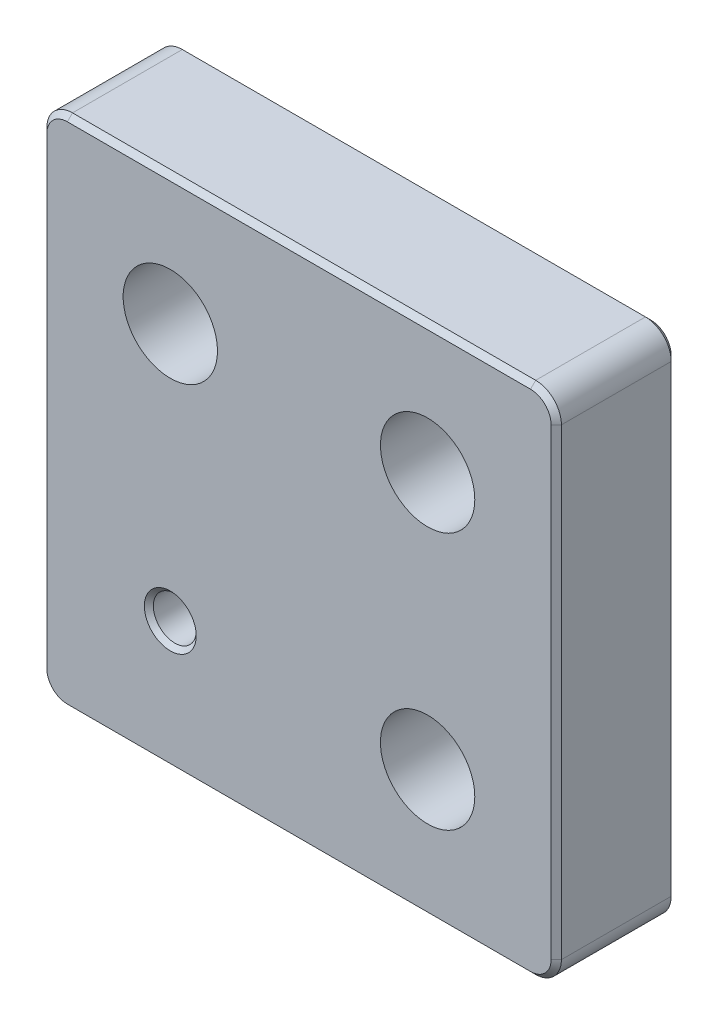
ISO-10303-21;
HEADER;
FILE_DESCRIPTION(('STEP AP214'),'2;1');
FILE_NAME('part.step','',(''),(''),'','','');
FILE_SCHEMA(('AUTOMOTIVE_DESIGN { 1 0 10303 214 1 1 1 1 }'));
ENDSEC;
DATA;
#1=APPLICATION_CONTEXT('core data for automotive mechanical design processes');
#2=APPLICATION_PROTOCOL_DEFINITION('international standard','automotive_design',2000,#1);
#3=PRODUCT_CONTEXT('',#1,'mechanical');
#4=PRODUCT('Part','Part','',(#3));
#5=PRODUCT_RELATED_PRODUCT_CATEGORY('part','',(#4));
#6=PRODUCT_DEFINITION_FORMATION('','',#4);
#7=PRODUCT_DEFINITION_CONTEXT('part definition',#1,'design');
#8=PRODUCT_DEFINITION('design','',#6,#7);
#9=PRODUCT_DEFINITION_SHAPE('','',#8);
#10=(LENGTH_UNIT() NAMED_UNIT(*) SI_UNIT(.MILLI.,.METRE.));
#11=(NAMED_UNIT(*) PLANE_ANGLE_UNIT() SI_UNIT($,.RADIAN.));
#12=(NAMED_UNIT(*) SI_UNIT($,.STERADIAN.) SOLID_ANGLE_UNIT());
#13=UNCERTAINTY_MEASURE_WITH_UNIT(LENGTH_MEASURE(1.E-05),#10,'distance_accuracy_value','');
#14=(GEOMETRIC_REPRESENTATION_CONTEXT(3) GLOBAL_UNCERTAINTY_ASSIGNED_CONTEXT((#13)) GLOBAL_UNIT_ASSIGNED_CONTEXT((#10,
#11,#12)) REPRESENTATION_CONTEXT('',''));
#15=CARTESIAN_POINT('',(0.,0.,0.));
#16=DIRECTION('',(0.,0.,1.));
#17=DIRECTION('',(1.,0.,0.));
#18=AXIS2_PLACEMENT_3D('',#15,#16,#17);
#19=CARTESIAN_POINT('',(-30.,-30.,14.));
#20=DIRECTION('',(1.,0.,0.));
#21=DIRECTION('',(0.,0.,-1.));
#22=AXIS2_PLACEMENT_3D('',#19,#20,#21);
#23=PLANE('',#22);
#24=DIRECTION('',(0.,0.,-1.));
#25=VECTOR('',#24,1.);
#26=CARTESIAN_POINT('',(-30.,27.,14.));
#27=LINE('',#26,#25);
#28=CARTESIAN_POINT('',(-30.,27.,13.4));
#29=VERTEX_POINT('',#28);
#30=CARTESIAN_POINT('',(-30.,27.,0.599999999999996));
#31=VERTEX_POINT('',#30);
#32=EDGE_CURVE('E343',#29,#31,#27,.T.);
#33=ORIENTED_EDGE('',*,*,#32,.T.);
#34=DIRECTION('',(0.,-1.,0.));
#35=VECTOR('',#34,1.);
#36=CARTESIAN_POINT('',(-30.,-30.,0.599999999999996));
#37=LINE('',#36,#35);
#38=CARTESIAN_POINT('',(-30.,-27.,0.599999999999996));
#39=VERTEX_POINT('',#38);
#40=EDGE_CURVE('E243',#31,#39,#37,.T.);
#41=ORIENTED_EDGE('',*,*,#40,.T.);
#42=DIRECTION('',(0.,0.,-1.));
#43=VECTOR('',#42,1.);
#44=CARTESIAN_POINT('',(-30.,-27.,14.));
#45=LINE('',#44,#43);
#46=CARTESIAN_POINT('',(-30.,-27.,13.4));
#47=VERTEX_POINT('',#46);
#48=EDGE_CURVE('E336',#39,#47,#45,.F.);
#49=ORIENTED_EDGE('',*,*,#48,.T.);
#50=DIRECTION('',(0.,1.,0.));
#51=VECTOR('',#50,1.);
#52=CARTESIAN_POINT('',(-30.,27.,13.4));
#53=LINE('',#52,#51);
#54=EDGE_CURVE('E240',#47,#29,#53,.T.);
#55=ORIENTED_EDGE('',*,*,#54,.T.);
#56=EDGE_LOOP('',(#33,#41,#49,#55));
#57=FACE_BOUND('',#56,.T.);
#58=ADVANCED_FACE('F46',(#57),#23,.F.);
#59=CARTESIAN_POINT('',(30.,-30.,14.));
#60=DIRECTION('',(0.,1.,0.));
#61=DIRECTION('',(-1.,0.,0.));
#62=AXIS2_PLACEMENT_3D('',#59,#60,#61);
#63=PLANE('',#62);
#64=DIRECTION('',(0.,0.,-1.));
#65=VECTOR('',#64,1.);
#66=CARTESIAN_POINT('',(-27.,-30.,14.));
#67=LINE('',#66,#65);
#68=CARTESIAN_POINT('',(-27.,-30.,13.4));
#69=VERTEX_POINT('',#68);
#70=CARTESIAN_POINT('',(-27.,-30.,0.599999999999996));
#71=VERTEX_POINT('',#70);
#72=EDGE_CURVE('E338',#69,#71,#67,.T.);
#73=ORIENTED_EDGE('',*,*,#72,.T.);
#74=DIRECTION('',(1.,0.,0.));
#75=VECTOR('',#74,1.);
#76=CARTESIAN_POINT('',(30.,-30.,0.599999999999996));
#77=LINE('',#76,#75);
#78=CARTESIAN_POINT('',(27.,-30.,0.599999999999996));
#79=VERTEX_POINT('',#78);
#80=EDGE_CURVE('E206',#71,#79,#77,.T.);
#81=ORIENTED_EDGE('',*,*,#80,.T.);
#82=DIRECTION('',(0.,0.,-1.));
#83=VECTOR('',#82,1.);
#84=CARTESIAN_POINT('',(27.,-30.,14.));
#85=LINE('',#84,#83);
#86=CARTESIAN_POINT('',(27.,-30.,13.4));
#87=VERTEX_POINT('',#86);
#88=EDGE_CURVE('E183',#79,#87,#85,.F.);
#89=ORIENTED_EDGE('',*,*,#88,.T.);
#90=DIRECTION('',(-1.,0.,0.));
#91=VECTOR('',#90,1.);
#92=CARTESIAN_POINT('',(-27.,-30.,13.4));
#93=LINE('',#92,#91);
#94=EDGE_CURVE('E203',#87,#69,#93,.T.);
#95=ORIENTED_EDGE('',*,*,#94,.T.);
#96=EDGE_LOOP('',(#73,#81,#89,#95));
#97=FACE_BOUND('',#96,.T.);
#98=ADVANCED_FACE('F400',(#97),#63,.F.);
#99=CARTESIAN_POINT('',(30.,-30.,14.));
#100=DIRECTION('',(-1.,0.,0.));
#101=DIRECTION('',(0.,0.,1.));
#102=AXIS2_PLACEMENT_3D('',#99,#100,#101);
#103=PLANE('',#102);
#104=DIRECTION('',(0.,0.,-1.));
#105=VECTOR('',#104,1.);
#106=CARTESIAN_POINT('',(30.,-27.,14.));
#107=LINE('',#106,#105);
#108=CARTESIAN_POINT('',(30.,-27.,13.4));
#109=VERTEX_POINT('',#108);
#110=CARTESIAN_POINT('',(30.,-27.,0.599999999999996));
#111=VERTEX_POINT('',#110);
#112=EDGE_CURVE('E363',#109,#111,#107,.T.);
#113=ORIENTED_EDGE('',*,*,#112,.T.);
#114=DIRECTION('',(0.,1.,0.));
#115=VECTOR('',#114,1.);
#116=CARTESIAN_POINT('',(30.,-30.,0.599999999999996));
#117=LINE('',#116,#115);
#118=CARTESIAN_POINT('',(30.,27.,0.599999999999996));
#119=VERTEX_POINT('',#118);
#120=EDGE_CURVE('E218',#111,#119,#117,.T.);
#121=ORIENTED_EDGE('',*,*,#120,.T.);
#122=DIRECTION('',(0.,0.,-1.));
#123=VECTOR('',#122,1.);
#124=CARTESIAN_POINT('',(30.,27.,14.));
#125=LINE('',#124,#123);
#126=CARTESIAN_POINT('',(30.,27.,13.4));
#127=VERTEX_POINT('',#126);
#128=EDGE_CURVE('E367',#119,#127,#125,.F.);
#129=ORIENTED_EDGE('',*,*,#128,.T.);
#130=DIRECTION('',(0.,-1.,0.));
#131=VECTOR('',#130,1.);
#132=CARTESIAN_POINT('',(30.,-27.,13.4));
#133=LINE('',#132,#131);
#134=EDGE_CURVE('E215',#127,#109,#133,.T.);
#135=ORIENTED_EDGE('',*,*,#134,.T.);
#136=EDGE_LOOP('',(#113,#121,#129,#135));
#137=FACE_BOUND('',#136,.T.);
#138=ADVANCED_FACE('F445',(#137),#103,.F.);
#139=CARTESIAN_POINT('',(30.,30.,14.));
#140=DIRECTION('',(0.,-1.,0.));
#141=DIRECTION('',(1.,0.,0.));
#142=AXIS2_PLACEMENT_3D('',#139,#140,#141);
#143=PLANE('',#142);
#144=DIRECTION('',(0.,0.,-1.));
#145=VECTOR('',#144,1.);
#146=CARTESIAN_POINT('',(27.,30.,14.));
#147=LINE('',#146,#145);
#148=CARTESIAN_POINT('',(27.,30.,13.4));
#149=VERTEX_POINT('',#148);
#150=CARTESIAN_POINT('',(27.,30.,0.599999999999996));
#151=VERTEX_POINT('',#150);
#152=EDGE_CURVE('E349',#149,#151,#147,.T.);
#153=ORIENTED_EDGE('',*,*,#152,.T.);
#154=DIRECTION('',(-1.,0.,0.));
#155=VECTOR('',#154,1.);
#156=CARTESIAN_POINT('',(30.,30.,0.599999999999996));
#157=LINE('',#156,#155);
#158=CARTESIAN_POINT('',(-27.,30.,0.599999999999996));
#159=VERTEX_POINT('',#158);
#160=EDGE_CURVE('E231',#151,#159,#157,.T.);
#161=ORIENTED_EDGE('',*,*,#160,.T.);
#162=DIRECTION('',(0.,0.,-1.));
#163=VECTOR('',#162,1.);
#164=CARTESIAN_POINT('',(-27.,30.,14.));
#165=LINE('',#164,#163);
#166=CARTESIAN_POINT('',(-27.,30.,13.4));
#167=VERTEX_POINT('',#166);
#168=EDGE_CURVE('E359',#159,#167,#165,.F.);
#169=ORIENTED_EDGE('',*,*,#168,.T.);
#170=DIRECTION('',(1.,0.,0.));
#171=VECTOR('',#170,1.);
#172=CARTESIAN_POINT('',(27.,30.,13.4));
#173=LINE('',#172,#171);
#174=EDGE_CURVE('E228',#167,#149,#173,.T.);
#175=ORIENTED_EDGE('',*,*,#174,.T.);
#176=EDGE_LOOP('',(#153,#161,#169,#175));
#177=FACE_BOUND('',#176,.T.);
#178=ADVANCED_FACE('F429',(#177),#143,.F.);
#179=CARTESIAN_POINT('',(0.,0.,14.));
#180=DIRECTION('',(0.,0.,1.));
#181=DIRECTION('',(1.,0.,0.));
#182=AXIS2_PLACEMENT_3D('',#179,#180,#181);
#183=PLANE('',#182);
#184=DIRECTION('',(0.,1.,0.));
#185=VECTOR('',#184,1.);
#186=CARTESIAN_POINT('',(29.4,27.,14.));
#187=LINE('',#186,#185);
#188=CARTESIAN_POINT('',(29.4,-27.,14.));
#189=VERTEX_POINT('',#188);
#190=CARTESIAN_POINT('',(29.4,27.,14.));
#191=VERTEX_POINT('',#190);
#192=EDGE_CURVE('E57',#189,#191,#187,.T.);
#193=ORIENTED_EDGE('',*,*,#192,.T.);
#194=CARTESIAN_POINT('',(27.,27.,14.));
#195=DIRECTION('',(0.,0.,1.));
#196=DIRECTION('',(1.,0.,0.));
#197=AXIS2_PLACEMENT_3D('',#194,#195,#196);
#198=CIRCLE('',#197,2.40000000000001);
#199=CARTESIAN_POINT('',(27.,29.4,14.));
#200=VERTEX_POINT('',#199);
#201=EDGE_CURVE('E11',#191,#200,#198,.T.);
#202=ORIENTED_EDGE('',*,*,#201,.T.);
#203=DIRECTION('',(-1.,0.,0.));
#204=VECTOR('',#203,1.);
#205=CARTESIAN_POINT('',(-27.,29.4,14.));
#206=LINE('',#205,#204);
#207=CARTESIAN_POINT('',(-27.,29.4,14.));
#208=VERTEX_POINT('',#207);
#209=EDGE_CURVE('E246',#200,#208,#206,.T.);
#210=ORIENTED_EDGE('',*,*,#209,.T.);
#211=CARTESIAN_POINT('',(-27.,27.,14.));
#212=DIRECTION('',(0.,0.,1.));
#213=DIRECTION('',(1.,0.,0.));
#214=AXIS2_PLACEMENT_3D('',#211,#212,#213);
#215=CIRCLE('',#214,2.40000000000001);
#216=CARTESIAN_POINT('',(-29.4,27.,14.));
#217=VERTEX_POINT('',#216);
#218=EDGE_CURVE('E249',#208,#217,#215,.T.);
#219=ORIENTED_EDGE('',*,*,#218,.T.);
#220=DIRECTION('',(0.,-1.,0.));
#221=VECTOR('',#220,1.);
#222=CARTESIAN_POINT('',(-29.4,-27.,14.));
#223=LINE('',#222,#221);
#224=CARTESIAN_POINT('',(-29.4,-27.,14.));
#225=VERTEX_POINT('',#224);
#226=EDGE_CURVE('E252',#217,#225,#223,.T.);
#227=ORIENTED_EDGE('',*,*,#226,.T.);
#228=CARTESIAN_POINT('',(-27.,-27.,14.));
#229=DIRECTION('',(0.,0.,1.));
#230=DIRECTION('',(1.,0.,0.));
#231=AXIS2_PLACEMENT_3D('',#228,#229,#230);
#232=CIRCLE('',#231,2.40000000000001);
#233=CARTESIAN_POINT('',(-27.,-29.4,14.));
#234=VERTEX_POINT('',#233);
#235=EDGE_CURVE('E255',#225,#234,#232,.T.);
#236=ORIENTED_EDGE('',*,*,#235,.T.);
#237=DIRECTION('',(1.,0.,0.));
#238=VECTOR('',#237,1.);
#239=CARTESIAN_POINT('',(27.,-29.4,14.));
#240=LINE('',#239,#238);
#241=CARTESIAN_POINT('',(27.,-29.4,14.));
#242=VERTEX_POINT('',#241);
#243=EDGE_CURVE('E258',#234,#242,#240,.T.);
#244=ORIENTED_EDGE('',*,*,#243,.T.);
#245=CARTESIAN_POINT('',(27.,-27.,14.));
#246=DIRECTION('',(0.,0.,1.));
#247=DIRECTION('',(1.,0.,0.));
#248=AXIS2_PLACEMENT_3D('',#245,#246,#247);
#249=CIRCLE('',#248,2.40000000000001);
#250=EDGE_CURVE('E68',#242,#189,#249,.T.);
#251=ORIENTED_EDGE('',*,*,#250,.T.);
#252=EDGE_LOOP('',(#193,#202,#210,#219,#227,#236,#244,#251));
#253=FACE_BOUND('',#252,.T.);
#254=CARTESIAN_POINT('',(-15.,-15.,14.));
#255=DIRECTION('',(0.,0.,1.));
#256=DIRECTION('',(1.,0.,0.));
#257=AXIS2_PLACEMENT_3D('',#254,#255,#256);
#258=CIRCLE('',#257,3.025);
#259=CARTESIAN_POINT('',(-11.975,-15.,14.));
#260=VERTEX_POINT('',#259);
#261=EDGE_CURVE('E289',#260,#260,#258,.T.);
#262=ORIENTED_EDGE('',*,*,#261,.F.);
#263=EDGE_LOOP('',(#262));
#264=FACE_BOUND('',#263,.T.);
#265=CARTESIAN_POINT('',(-15.,15.,14.));
#266=DIRECTION('',(0.,0.,1.));
#267=DIRECTION('',(1.,0.,0.));
#268=AXIS2_PLACEMENT_3D('',#265,#266,#267);
#269=CIRCLE('',#268,5.49999999999999);
#270=CARTESIAN_POINT('',(-9.50000000000001,15.,14.));
#271=VERTEX_POINT('',#270);
#272=EDGE_CURVE('E939',#271,#271,#269,.T.);
#273=ORIENTED_EDGE('',*,*,#272,.F.);
#274=EDGE_LOOP('',(#273));
#275=FACE_BOUND('',#274,.T.);
#276=CARTESIAN_POINT('',(15.,15.,14.));
#277=DIRECTION('',(0.,0.,1.));
#278=DIRECTION('',(1.,0.,0.));
#279=AXIS2_PLACEMENT_3D('',#276,#277,#278);
#280=CIRCLE('',#279,5.49999999999999);
#281=CARTESIAN_POINT('',(20.5,15.,14.));
#282=VERTEX_POINT('',#281);
#283=EDGE_CURVE('E923',#282,#282,#280,.T.);
#284=ORIENTED_EDGE('',*,*,#283,.F.);
#285=EDGE_LOOP('',(#284));
#286=FACE_BOUND('',#285,.T.);
#287=CARTESIAN_POINT('',(15.,-15.,14.));
#288=DIRECTION('',(0.,0.,1.));
#289=DIRECTION('',(1.,0.,0.));
#290=AXIS2_PLACEMENT_3D('',#287,#288,#289);
#291=CIRCLE('',#290,5.49999999999999);
#292=CARTESIAN_POINT('',(20.5,-15.,14.));
#293=VERTEX_POINT('',#292);
#294=EDGE_CURVE('E905',#293,#293,#291,.T.);
#295=ORIENTED_EDGE('',*,*,#294,.F.);
#296=EDGE_LOOP('',(#295));
#297=FACE_BOUND('',#296,.T.);
#298=ADVANCED_FACE('F416',(#253,#264,#275,#286,#297),#183,.T.);
#299=CARTESIAN_POINT('',(0.,0.,0.));
#300=DIRECTION('',(0.,0.,1.));
#301=DIRECTION('',(1.,0.,0.));
#302=AXIS2_PLACEMENT_3D('',#299,#300,#301);
#303=PLANE('',#302);
#304=DIRECTION('',(-1.,0.,0.));
#305=VECTOR('',#304,1.);
#306=CARTESIAN_POINT('',(0.,-29.4,0.));
#307=LINE('',#306,#305);
#308=CARTESIAN_POINT('',(27.,-29.4,0.));
#309=VERTEX_POINT('',#308);
#310=CARTESIAN_POINT('',(-27.,-29.4,0.));
#311=VERTEX_POINT('',#310);
#312=EDGE_CURVE('E188',#309,#311,#307,.T.);
#313=ORIENTED_EDGE('',*,*,#312,.T.);
#314=CARTESIAN_POINT('',(-27.,-27.,0.));
#315=DIRECTION('',(0.,0.,1.));
#316=DIRECTION('',(1.,0.,0.));
#317=AXIS2_PLACEMENT_3D('',#314,#315,#316);
#318=CIRCLE('',#317,2.4);
#319=CARTESIAN_POINT('',(-29.4,-27.,0.));
#320=VERTEX_POINT('',#319);
#321=EDGE_CURVE('E166',#311,#320,#318,.F.);
#322=ORIENTED_EDGE('',*,*,#321,.T.);
#323=DIRECTION('',(0.,1.,0.));
#324=VECTOR('',#323,1.);
#325=CARTESIAN_POINT('',(-29.4,0.,0.));
#326=LINE('',#325,#324);
#327=CARTESIAN_POINT('',(-29.4,27.,0.));
#328=VERTEX_POINT('',#327);
#329=EDGE_CURVE('E175',#320,#328,#326,.T.);
#330=ORIENTED_EDGE('',*,*,#329,.T.);
#331=CARTESIAN_POINT('',(-27.,27.,0.));
#332=DIRECTION('',(0.,0.,1.));
#333=DIRECTION('',(1.,0.,0.));
#334=AXIS2_PLACEMENT_3D('',#331,#332,#333);
#335=CIRCLE('',#334,2.4);
#336=CARTESIAN_POINT('',(-27.,29.4,0.));
#337=VERTEX_POINT('',#336);
#338=EDGE_CURVE('E182',#328,#337,#335,.F.);
#339=ORIENTED_EDGE('',*,*,#338,.T.);
#340=DIRECTION('',(1.,0.,0.));
#341=VECTOR('',#340,1.);
#342=CARTESIAN_POINT('',(0.,29.4,0.));
#343=LINE('',#342,#341);
#344=CARTESIAN_POINT('',(27.,29.4,0.));
#345=VERTEX_POINT('',#344);
#346=EDGE_CURVE('E378',#337,#345,#343,.T.);
#347=ORIENTED_EDGE('',*,*,#346,.T.);
#348=CARTESIAN_POINT('',(27.,27.,0.));
#349=DIRECTION('',(0.,0.,1.));
#350=DIRECTION('',(1.,0.,0.));
#351=AXIS2_PLACEMENT_3D('',#348,#349,#350);
#352=CIRCLE('',#351,2.4);
#353=CARTESIAN_POINT('',(29.4,27.,0.));
#354=VERTEX_POINT('',#353);
#355=EDGE_CURVE('E381',#345,#354,#352,.F.);
#356=ORIENTED_EDGE('',*,*,#355,.T.);
#357=DIRECTION('',(0.,-1.,0.));
#358=VECTOR('',#357,1.);
#359=CARTESIAN_POINT('',(29.4,0.,0.));
#360=LINE('',#359,#358);
#361=CARTESIAN_POINT('',(29.4,-27.,0.));
#362=VERTEX_POINT('',#361);
#363=EDGE_CURVE('E384',#354,#362,#360,.T.);
#364=ORIENTED_EDGE('',*,*,#363,.T.);
#365=CARTESIAN_POINT('',(27.,-27.,0.));
#366=DIRECTION('',(0.,0.,1.));
#367=DIRECTION('',(1.,0.,0.));
#368=AXIS2_PLACEMENT_3D('',#365,#366,#367);
#369=CIRCLE('',#368,2.4);
#370=EDGE_CURVE('E197',#362,#309,#369,.F.);
#371=ORIENTED_EDGE('',*,*,#370,.T.);
#372=EDGE_LOOP('',(#313,#322,#330,#339,#347,#356,#364,#371));
#373=FACE_BOUND('',#372,.T.);
#374=CARTESIAN_POINT('',(-15.,-15.,0.));
#375=DIRECTION('',(0.,0.,1.));
#376=DIRECTION('',(1.,0.,0.));
#377=AXIS2_PLACEMENT_3D('',#374,#375,#376);
#378=CIRCLE('',#377,2.5);
#379=CARTESIAN_POINT('',(-12.5,-15.,0.));
#380=VERTEX_POINT('',#379);
#381=EDGE_CURVE('E943',#380,#380,#378,.T.);
#382=ORIENTED_EDGE('',*,*,#381,.T.);
#383=EDGE_LOOP('',(#382));
#384=FACE_BOUND('',#383,.T.);
#385=CARTESIAN_POINT('',(-15.,15.,0.));
#386=DIRECTION('',(0.,0.,1.));
#387=DIRECTION('',(1.,0.,0.));
#388=AXIS2_PLACEMENT_3D('',#385,#386,#387);
#389=CIRCLE('',#388,3.25);
#390=CARTESIAN_POINT('',(-11.75,15.,0.));
#391=VERTEX_POINT('',#390);
#392=EDGE_CURVE('E927',#391,#391,#389,.T.);
#393=ORIENTED_EDGE('',*,*,#392,.T.);
#394=EDGE_LOOP('',(#393));
#395=FACE_BOUND('',#394,.T.);
#396=CARTESIAN_POINT('',(15.,15.,0.));
#397=DIRECTION('',(0.,0.,1.));
#398=DIRECTION('',(1.,0.,0.));
#399=AXIS2_PLACEMENT_3D('',#396,#397,#398);
#400=CIRCLE('',#399,3.25);
#401=CARTESIAN_POINT('',(18.25,15.,0.));
#402=VERTEX_POINT('',#401);
#403=EDGE_CURVE('E911',#402,#402,#400,.T.);
#404=ORIENTED_EDGE('',*,*,#403,.T.);
#405=EDGE_LOOP('',(#404));
#406=FACE_BOUND('',#405,.T.);
#407=CARTESIAN_POINT('',(15.,-15.,0.));
#408=DIRECTION('',(0.,0.,1.));
#409=DIRECTION('',(1.,0.,0.));
#410=AXIS2_PLACEMENT_3D('',#407,#408,#409);
#411=CIRCLE('',#410,3.25);
#412=CARTESIAN_POINT('',(18.25,-15.,0.));
#413=VERTEX_POINT('',#412);
#414=EDGE_CURVE('E344',#413,#413,#411,.T.);
#415=ORIENTED_EDGE('',*,*,#414,.T.);
#416=EDGE_LOOP('',(#415));
#417=FACE_BOUND('',#416,.T.);
#418=ADVANCED_FACE('F185',(#373,#384,#395,#406,#417),#303,.F.);
#419=CARTESIAN_POINT('',(15.,-15.,14.));
#420=DIRECTION('',(0.,0.,1.));
#421=DIRECTION('',(1.,0.,0.));
#422=AXIS2_PLACEMENT_3D('',#419,#420,#421);
#423=CYLINDRICAL_SURFACE('',#422,3.25);
#424=ORIENTED_EDGE('',*,*,#414,.F.);
#425=EDGE_LOOP('',(#424));
#426=FACE_BOUND('',#425,.T.);
#427=CARTESIAN_POINT('',(15.,-15.,6.));
#428=DIRECTION('',(0.,0.,1.));
#429=DIRECTION('',(1.,0.,0.));
#430=AXIS2_PLACEMENT_3D('',#427,#428,#429);
#431=CIRCLE('',#430,3.25);
#432=CARTESIAN_POINT('',(18.25,-15.,6.));
#433=VERTEX_POINT('',#432);
#434=EDGE_CURVE('E352',#433,#433,#431,.T.);
#435=ORIENTED_EDGE('',*,*,#434,.T.);
#436=EDGE_LOOP('',(#435));
#437=FACE_BOUND('',#436,.T.);
#438=ADVANCED_FACE('F682',(#426,#437),#423,.F.);
#439=CARTESIAN_POINT('',(18.25,-15.,6.));
#440=DIRECTION('',(0.,0.,-1.));
#441=DIRECTION('',(-1.,0.,0.));
#442=AXIS2_PLACEMENT_3D('',#439,#440,#441);
#443=PLANE('',#442);
#444=ORIENTED_EDGE('',*,*,#434,.F.);
#445=EDGE_LOOP('',(#444));
#446=FACE_BOUND('',#445,.T.);
#447=CARTESIAN_POINT('',(15.,-15.,6.));
#448=DIRECTION('',(0.,0.,1.));
#449=DIRECTION('',(1.,0.,0.));
#450=AXIS2_PLACEMENT_3D('',#447,#448,#449);
#451=CIRCLE('',#450,5.5);
#452=CARTESIAN_POINT('',(20.5,-15.,6.));
#453=VERTEX_POINT('',#452);
#454=EDGE_CURVE('E901',#453,#453,#451,.T.);
#455=ORIENTED_EDGE('',*,*,#454,.T.);
#456=EDGE_LOOP('',(#455));
#457=FACE_BOUND('',#456,.T.);
#458=ADVANCED_FACE('F674',(#446,#457),#443,.F.);
#459=CARTESIAN_POINT('',(15.,-15.,14.));
#460=DIRECTION('',(0.,0.,1.));
#461=DIRECTION('',(1.,0.,0.));
#462=AXIS2_PLACEMENT_3D('',#459,#460,#461);
#463=CYLINDRICAL_SURFACE('',#462,5.5);
#464=ORIENTED_EDGE('',*,*,#454,.F.);
#465=EDGE_LOOP('',(#464));
#466=FACE_BOUND('',#465,.T.);
#467=ORIENTED_EDGE('',*,*,#294,.T.);
#468=EDGE_LOOP('',(#467));
#469=FACE_BOUND('',#468,.T.);
#470=ADVANCED_FACE('F666',(#466,#469),#463,.F.);
#471=CARTESIAN_POINT('',(15.,15.,14.));
#472=DIRECTION('',(0.,0.,1.));
#473=DIRECTION('',(1.,0.,0.));
#474=AXIS2_PLACEMENT_3D('',#471,#472,#473);
#475=CYLINDRICAL_SURFACE('',#474,3.25);
#476=ORIENTED_EDGE('',*,*,#403,.F.);
#477=EDGE_LOOP('',(#476));
#478=FACE_BOUND('',#477,.T.);
#479=CARTESIAN_POINT('',(15.,15.,6.));
#480=DIRECTION('',(0.,0.,1.));
#481=DIRECTION('',(1.,0.,0.));
#482=AXIS2_PLACEMENT_3D('',#479,#480,#481);
#483=CIRCLE('',#482,3.25);
#484=CARTESIAN_POINT('',(18.25,15.,6.));
#485=VERTEX_POINT('',#484);
#486=EDGE_CURVE('E915',#485,#485,#483,.T.);
#487=ORIENTED_EDGE('',*,*,#486,.T.);
#488=EDGE_LOOP('',(#487));
#489=FACE_BOUND('',#488,.T.);
#490=ADVANCED_FACE('F658',(#478,#489),#475,.F.);
#491=CARTESIAN_POINT('',(18.25,15.,6.));
#492=DIRECTION('',(0.,0.,-1.));
#493=DIRECTION('',(-1.,0.,0.));
#494=AXIS2_PLACEMENT_3D('',#491,#492,#493);
#495=PLANE('',#494);
#496=ORIENTED_EDGE('',*,*,#486,.F.);
#497=EDGE_LOOP('',(#496));
#498=FACE_BOUND('',#497,.T.);
#499=CARTESIAN_POINT('',(15.,15.,6.));
#500=DIRECTION('',(0.,0.,1.));
#501=DIRECTION('',(1.,0.,0.));
#502=AXIS2_PLACEMENT_3D('',#499,#500,#501);
#503=CIRCLE('',#502,5.5);
#504=CARTESIAN_POINT('',(20.5,15.,6.));
#505=VERTEX_POINT('',#504);
#506=EDGE_CURVE('E919',#505,#505,#503,.T.);
#507=ORIENTED_EDGE('',*,*,#506,.T.);
#508=EDGE_LOOP('',(#507));
#509=FACE_BOUND('',#508,.T.);
#510=ADVANCED_FACE('F650',(#498,#509),#495,.F.);
#511=CARTESIAN_POINT('',(15.,15.,14.));
#512=DIRECTION('',(0.,0.,1.));
#513=DIRECTION('',(1.,0.,0.));
#514=AXIS2_PLACEMENT_3D('',#511,#512,#513);
#515=CYLINDRICAL_SURFACE('',#514,5.5);
#516=ORIENTED_EDGE('',*,*,#506,.F.);
#517=EDGE_LOOP('',(#516));
#518=FACE_BOUND('',#517,.T.);
#519=ORIENTED_EDGE('',*,*,#283,.T.);
#520=EDGE_LOOP('',(#519));
#521=FACE_BOUND('',#520,.T.);
#522=ADVANCED_FACE('F642',(#518,#521),#515,.F.);
#523=CARTESIAN_POINT('',(-15.,15.,14.));
#524=DIRECTION('',(0.,0.,1.));
#525=DIRECTION('',(1.,0.,0.));
#526=AXIS2_PLACEMENT_3D('',#523,#524,#525);
#527=CYLINDRICAL_SURFACE('',#526,3.25);
#528=ORIENTED_EDGE('',*,*,#392,.F.);
#529=EDGE_LOOP('',(#528));
#530=FACE_BOUND('',#529,.T.);
#531=CARTESIAN_POINT('',(-15.,15.,6.));
#532=DIRECTION('',(0.,0.,1.));
#533=DIRECTION('',(1.,0.,0.));
#534=AXIS2_PLACEMENT_3D('',#531,#532,#533);
#535=CIRCLE('',#534,3.25);
#536=CARTESIAN_POINT('',(-11.75,15.,6.));
#537=VERTEX_POINT('',#536);
#538=EDGE_CURVE('E931',#537,#537,#535,.T.);
#539=ORIENTED_EDGE('',*,*,#538,.T.);
#540=EDGE_LOOP('',(#539));
#541=FACE_BOUND('',#540,.T.);
#542=ADVANCED_FACE('F634',(#530,#541),#527,.F.);
#543=CARTESIAN_POINT('',(-11.75,15.,6.));
#544=DIRECTION('',(0.,0.,-1.));
#545=DIRECTION('',(-1.,0.,0.));
#546=AXIS2_PLACEMENT_3D('',#543,#544,#545);
#547=PLANE('',#546);
#548=ORIENTED_EDGE('',*,*,#538,.F.);
#549=EDGE_LOOP('',(#548));
#550=FACE_BOUND('',#549,.T.);
#551=CARTESIAN_POINT('',(-15.,15.,6.));
#552=DIRECTION('',(0.,0.,1.));
#553=DIRECTION('',(1.,0.,0.));
#554=AXIS2_PLACEMENT_3D('',#551,#552,#553);
#555=CIRCLE('',#554,5.5);
#556=CARTESIAN_POINT('',(-9.50000000000001,15.,6.));
#557=VERTEX_POINT('',#556);
#558=EDGE_CURVE('E935',#557,#557,#555,.T.);
#559=ORIENTED_EDGE('',*,*,#558,.T.);
#560=EDGE_LOOP('',(#559));
#561=FACE_BOUND('',#560,.T.);
#562=ADVANCED_FACE('F625',(#550,#561),#547,.F.);
#563=CARTESIAN_POINT('',(-15.,15.,14.));
#564=DIRECTION('',(0.,0.,1.));
#565=DIRECTION('',(1.,0.,0.));
#566=AXIS2_PLACEMENT_3D('',#563,#564,#565);
#567=CYLINDRICAL_SURFACE('',#566,5.5);
#568=ORIENTED_EDGE('',*,*,#558,.F.);
#569=EDGE_LOOP('',(#568));
#570=FACE_BOUND('',#569,.T.);
#571=ORIENTED_EDGE('',*,*,#272,.T.);
#572=EDGE_LOOP('',(#571));
#573=FACE_BOUND('',#572,.T.);
#574=ADVANCED_FACE('F618',(#570,#573),#567,.F.);
#575=CARTESIAN_POINT('',(-15.,-15.,14.));
#576=DIRECTION('',(0.,0.,1.));
#577=DIRECTION('',(1.,0.,0.));
#578=AXIS2_PLACEMENT_3D('',#575,#576,#577);
#579=CYLINDRICAL_SURFACE('',#578,2.5);
#580=ORIENTED_EDGE('',*,*,#381,.F.);
#581=EDGE_LOOP('',(#580));
#582=FACE_BOUND('',#581,.T.);
#583=CARTESIAN_POINT('',(-15.,-15.,13.475));
#584=DIRECTION('',(0.,0.,1.));
#585=DIRECTION('',(1.,0.,0.));
#586=AXIS2_PLACEMENT_3D('',#583,#584,#585);
#587=CIRCLE('',#586,2.5);
#588=CARTESIAN_POINT('',(-12.5,-15.,13.475));
#589=VERTEX_POINT('',#588);
#590=EDGE_CURVE('E947',#589,#589,#587,.T.);
#591=ORIENTED_EDGE('',*,*,#590,.T.);
#592=EDGE_LOOP('',(#591));
#593=FACE_BOUND('',#592,.T.);
#594=ADVANCED_FACE('F608',(#582,#593),#579,.F.);
#595=CARTESIAN_POINT('',(-15.,-15.,14.));
#596=DIRECTION('',(0.,0.,1.));
#597=DIRECTION('',(1.,0.,0.));
#598=AXIS2_PLACEMENT_3D('',#595,#596,#597);
#599=CONICAL_SURFACE('',#598,3.025,0.785398163397448);
#600=ORIENTED_EDGE('',*,*,#590,.F.);
#601=EDGE_LOOP('',(#600));
#602=FACE_BOUND('',#601,.T.);
#603=ORIENTED_EDGE('',*,*,#261,.T.);
#604=EDGE_LOOP('',(#603));
#605=FACE_BOUND('',#604,.T.);
#606=ADVANCED_FACE('F462',(#602,#605),#599,.F.);
#607=CARTESIAN_POINT('',(-27.,27.,14.));
#608=DIRECTION('',(0.,0.,-1.));
#609=DIRECTION('',(-1.,0.,0.));
#610=AXIS2_PLACEMENT_3D('',#607,#608,#609);
#611=CYLINDRICAL_SURFACE('',#610,3.);
#612=ORIENTED_EDGE('',*,*,#168,.F.);
#613=CARTESIAN_POINT('',(-27.,27.,0.599999999999996));
#614=DIRECTION('',(0.,0.,1.));
#615=DIRECTION('',(1.,0.,0.));
#616=AXIS2_PLACEMENT_3D('',#613,#614,#615);
#617=CIRCLE('',#616,3.);
#618=EDGE_CURVE('E237',#159,#31,#617,.T.);
#619=ORIENTED_EDGE('',*,*,#618,.T.);
#620=ORIENTED_EDGE('',*,*,#32,.F.);
#621=CARTESIAN_POINT('',(-27.,27.,13.4));
#622=DIRECTION('',(0.,0.,1.));
#623=DIRECTION('',(1.,0.,0.));
#624=AXIS2_PLACEMENT_3D('',#621,#622,#623);
#625=CIRCLE('',#624,3.);
#626=EDGE_CURVE('E234',#29,#167,#625,.F.);
#627=ORIENTED_EDGE('',*,*,#626,.T.);
#628=EDGE_LOOP('',(#612,#619,#620,#627));
#629=FACE_BOUND('',#628,.T.);
#630=ADVANCED_FACE('F459',(#629),#611,.T.);
#631=CARTESIAN_POINT('',(27.,27.,14.));
#632=DIRECTION('',(0.,0.,-1.));
#633=DIRECTION('',(-1.,0.,0.));
#634=AXIS2_PLACEMENT_3D('',#631,#632,#633);
#635=CYLINDRICAL_SURFACE('',#634,3.);
#636=ORIENTED_EDGE('',*,*,#128,.F.);
#637=CARTESIAN_POINT('',(27.,27.,0.599999999999996));
#638=DIRECTION('',(0.,0.,1.));
#639=DIRECTION('',(1.,0.,0.));
#640=AXIS2_PLACEMENT_3D('',#637,#638,#639);
#641=CIRCLE('',#640,3.);
#642=EDGE_CURVE('E225',#119,#151,#641,.T.);
#643=ORIENTED_EDGE('',*,*,#642,.T.);
#644=ORIENTED_EDGE('',*,*,#152,.F.);
#645=CARTESIAN_POINT('',(27.,27.,13.4));
#646=DIRECTION('',(0.,0.,1.));
#647=DIRECTION('',(1.,0.,0.));
#648=AXIS2_PLACEMENT_3D('',#645,#646,#647);
#649=CIRCLE('',#648,3.);
#650=EDGE_CURVE('E221',#149,#127,#649,.F.);
#651=ORIENTED_EDGE('',*,*,#650,.T.);
#652=EDGE_LOOP('',(#636,#643,#644,#651));
#653=FACE_BOUND('',#652,.T.);
#654=ADVANCED_FACE('F434',(#653),#635,.T.);
#655=CARTESIAN_POINT('',(27.,-27.,14.));
#656=DIRECTION('',(0.,0.,-1.));
#657=DIRECTION('',(-1.,0.,0.));
#658=AXIS2_PLACEMENT_3D('',#655,#656,#657);
#659=CYLINDRICAL_SURFACE('',#658,3.);
#660=ORIENTED_EDGE('',*,*,#88,.F.);
#661=CARTESIAN_POINT('',(27.,-27.,0.599999999999996));
#662=DIRECTION('',(0.,0.,1.));
#663=DIRECTION('',(1.,0.,0.));
#664=AXIS2_PLACEMENT_3D('',#661,#662,#663);
#665=CIRCLE('',#664,3.);
#666=EDGE_CURVE('E212',#79,#111,#665,.T.);
#667=ORIENTED_EDGE('',*,*,#666,.T.);
#668=ORIENTED_EDGE('',*,*,#112,.F.);
#669=CARTESIAN_POINT('',(27.,-27.,13.4));
#670=DIRECTION('',(0.,0.,1.));
#671=DIRECTION('',(1.,0.,0.));
#672=AXIS2_PLACEMENT_3D('',#669,#670,#671);
#673=CIRCLE('',#672,3.);
#674=EDGE_CURVE('E209',#109,#87,#673,.F.);
#675=ORIENTED_EDGE('',*,*,#674,.T.);
#676=EDGE_LOOP('',(#660,#667,#668,#675));
#677=FACE_BOUND('',#676,.T.);
#678=ADVANCED_FACE('F402',(#677),#659,.T.);
#679=CARTESIAN_POINT('',(-27.,-27.,14.));
#680=DIRECTION('',(0.,0.,-1.));
#681=DIRECTION('',(-1.,0.,0.));
#682=AXIS2_PLACEMENT_3D('',#679,#680,#681);
#683=CYLINDRICAL_SURFACE('',#682,3.);
#684=ORIENTED_EDGE('',*,*,#48,.F.);
#685=CARTESIAN_POINT('',(-27.,-27.,0.599999999999996));
#686=DIRECTION('',(0.,0.,1.));
#687=DIRECTION('',(1.,0.,0.));
#688=AXIS2_PLACEMENT_3D('',#685,#686,#687);
#689=CIRCLE('',#688,3.);
#690=EDGE_CURVE('E168',#39,#71,#689,.T.);
#691=ORIENTED_EDGE('',*,*,#690,.T.);
#692=ORIENTED_EDGE('',*,*,#72,.F.);
#693=CARTESIAN_POINT('',(-27.,-27.,13.4));
#694=DIRECTION('',(0.,0.,1.));
#695=DIRECTION('',(1.,0.,0.));
#696=AXIS2_PLACEMENT_3D('',#693,#694,#695);
#697=CIRCLE('',#696,3.);
#698=EDGE_CURVE('E191',#69,#47,#697,.F.);
#699=ORIENTED_EDGE('',*,*,#698,.T.);
#700=EDGE_LOOP('',(#684,#691,#692,#699));
#701=FACE_BOUND('',#700,.T.);
#702=ADVANCED_FACE('F335',(#701),#683,.T.);
#703=CARTESIAN_POINT('',(27.,27.,0.));
#704=DIRECTION('',(0.,0.,1.));
#705=DIRECTION('',(1.,0.,0.));
#706=AXIS2_PLACEMENT_3D('',#703,#704,#705);
#707=CONICAL_SURFACE('',#706,2.4,0.785398163397455);
#708=DIRECTION('',(0.,-0.707106781186552,-0.707106781186543));
#709=VECTOR('',#708,1.);
#710=CARTESIAN_POINT('',(27.,30.,0.599999999999996));
#711=LINE('',#710,#709);
#712=EDGE_CURVE('E281',#151,#345,#711,.T.);
#713=ORIENTED_EDGE('',*,*,#712,.F.);
#714=ORIENTED_EDGE('',*,*,#642,.F.);
#715=DIRECTION('',(0.707106781186552,0.,0.707106781186543));
#716=VECTOR('',#715,1.);
#717=CARTESIAN_POINT('',(29.4,27.,0.));
#718=LINE('',#717,#716);
#719=EDGE_CURVE('E285',#354,#119,#718,.T.);
#720=ORIENTED_EDGE('',*,*,#719,.F.);
#721=ORIENTED_EDGE('',*,*,#355,.F.);
#722=EDGE_LOOP('',(#713,#714,#720,#721));
#723=FACE_BOUND('',#722,.T.);
#724=ADVANCED_FACE('F438',(#723),#707,.T.);
#725=CARTESIAN_POINT('',(30.,-30.,0.599999999999996));
#726=DIRECTION('',(-0.707106781186543,0.,0.707106781186552));
#727=DIRECTION('',(0.,1.,0.));
#728=AXIS2_PLACEMENT_3D('',#725,#726,#727);
#729=PLANE('',#728);
#730=ORIENTED_EDGE('',*,*,#719,.T.);
#731=ORIENTED_EDGE('',*,*,#120,.F.);
#732=DIRECTION('',(0.707106781186552,0.,0.707106781186543));
#733=VECTOR('',#732,1.);
#734=CARTESIAN_POINT('',(29.4,-27.,0.));
#735=LINE('',#734,#733);
#736=EDGE_CURVE('E277',#362,#111,#735,.T.);
#737=ORIENTED_EDGE('',*,*,#736,.F.);
#738=ORIENTED_EDGE('',*,*,#363,.F.);
#739=EDGE_LOOP('',(#730,#731,#737,#738));
#740=FACE_BOUND('',#739,.T.);
#741=ADVANCED_FACE('F443',(#740),#729,.F.);
#742=CARTESIAN_POINT('',(30.,30.,0.599999999999996));
#743=DIRECTION('',(0.,-0.707106781186543,0.707106781186552));
#744=DIRECTION('',(-1.,0.,0.));
#745=AXIS2_PLACEMENT_3D('',#742,#743,#744);
#746=PLANE('',#745);
#747=ORIENTED_EDGE('',*,*,#712,.T.);
#748=ORIENTED_EDGE('',*,*,#346,.F.);
#749=DIRECTION('',(0.,-0.707106781186552,-0.707106781186543));
#750=VECTOR('',#749,1.);
#751=CARTESIAN_POINT('',(-27.,30.,0.599999999999996));
#752=LINE('',#751,#750);
#753=EDGE_CURVE('E273',#159,#337,#752,.T.);
#754=ORIENTED_EDGE('',*,*,#753,.F.);
#755=ORIENTED_EDGE('',*,*,#160,.F.);
#756=EDGE_LOOP('',(#747,#748,#754,#755));
#757=FACE_BOUND('',#756,.T.);
#758=ADVANCED_FACE('F498',(#757),#746,.F.);
#759=CARTESIAN_POINT('',(27.,-27.,0.));
#760=DIRECTION('',(0.,0.,1.));
#761=DIRECTION('',(1.,0.,0.));
#762=AXIS2_PLACEMENT_3D('',#759,#760,#761);
#763=CONICAL_SURFACE('',#762,2.4,0.785398163397455);
#764=ORIENTED_EDGE('',*,*,#736,.T.);
#765=ORIENTED_EDGE('',*,*,#666,.F.);
#766=DIRECTION('',(0.,-0.707106781186552,0.707106781186543));
#767=VECTOR('',#766,1.);
#768=CARTESIAN_POINT('',(27.,-29.4,0.));
#769=LINE('',#768,#767);
#770=EDGE_CURVE('E269',#309,#79,#769,.T.);
#771=ORIENTED_EDGE('',*,*,#770,.F.);
#772=ORIENTED_EDGE('',*,*,#370,.F.);
#773=EDGE_LOOP('',(#764,#765,#771,#772));
#774=FACE_BOUND('',#773,.T.);
#775=ADVANCED_FACE('F394',(#774),#763,.T.);
#776=CARTESIAN_POINT('',(-27.,27.,0.));
#777=DIRECTION('',(0.,0.,1.));
#778=DIRECTION('',(1.,0.,0.));
#779=AXIS2_PLACEMENT_3D('',#776,#777,#778);
#780=CONICAL_SURFACE('',#779,2.4,0.785398163397455);
#781=ORIENTED_EDGE('',*,*,#753,.T.);
#782=ORIENTED_EDGE('',*,*,#338,.F.);
#783=DIRECTION('',(0.707106781186552,0.,-0.707106781186543));
#784=VECTOR('',#783,1.);
#785=CARTESIAN_POINT('',(-30.,27.,0.599999999999996));
#786=LINE('',#785,#784);
#787=EDGE_CURVE('E178',#31,#328,#786,.T.);
#788=ORIENTED_EDGE('',*,*,#787,.F.);
#789=ORIENTED_EDGE('',*,*,#618,.F.);
#790=EDGE_LOOP('',(#781,#782,#788,#789));
#791=FACE_BOUND('',#790,.T.);
#792=ADVANCED_FACE('F486',(#791),#780,.T.);
#793=CARTESIAN_POINT('',(30.,-30.,0.599999999999996));
#794=DIRECTION('',(0.,0.707106781186543,0.707106781186552));
#795=DIRECTION('',(1.,0.,0.));
#796=AXIS2_PLACEMENT_3D('',#793,#794,#795);
#797=PLANE('',#796);
#798=ORIENTED_EDGE('',*,*,#770,.T.);
#799=ORIENTED_EDGE('',*,*,#80,.F.);
#800=DIRECTION('',(0.,-0.707106781186552,0.707106781186543));
#801=VECTOR('',#800,1.);
#802=CARTESIAN_POINT('',(-27.,-29.4,0.));
#803=LINE('',#802,#801);
#804=EDGE_CURVE('E172',#311,#71,#803,.T.);
#805=ORIENTED_EDGE('',*,*,#804,.F.);
#806=ORIENTED_EDGE('',*,*,#312,.F.);
#807=EDGE_LOOP('',(#798,#799,#805,#806));
#808=FACE_BOUND('',#807,.T.);
#809=ADVANCED_FACE('F397',(#808),#797,.F.);
#810=CARTESIAN_POINT('',(-30.,-30.,0.599999999999996));
#811=DIRECTION('',(0.707106781186543,0.,0.707106781186552));
#812=DIRECTION('',(0.,-1.,0.));
#813=AXIS2_PLACEMENT_3D('',#810,#811,#812);
#814=PLANE('',#813);
#815=ORIENTED_EDGE('',*,*,#787,.T.);
#816=ORIENTED_EDGE('',*,*,#329,.F.);
#817=DIRECTION('',(0.707106781186552,0.,-0.707106781186543));
#818=VECTOR('',#817,1.);
#819=CARTESIAN_POINT('',(-30.,-27.,0.599999999999996));
#820=LINE('',#819,#818);
#821=EDGE_CURVE('E162',#39,#320,#820,.T.);
#822=ORIENTED_EDGE('',*,*,#821,.F.);
#823=ORIENTED_EDGE('',*,*,#40,.F.);
#824=EDGE_LOOP('',(#815,#816,#822,#823));
#825=FACE_BOUND('',#824,.T.);
#826=ADVANCED_FACE('F176',(#825),#814,.F.);
#827=CARTESIAN_POINT('',(-27.,-27.,0.));
#828=DIRECTION('',(0.,0.,1.));
#829=DIRECTION('',(1.,0.,0.));
#830=AXIS2_PLACEMENT_3D('',#827,#828,#829);
#831=CONICAL_SURFACE('',#830,2.4,0.785398163397455);
#832=ORIENTED_EDGE('',*,*,#804,.T.);
#833=ORIENTED_EDGE('',*,*,#690,.F.);
#834=ORIENTED_EDGE('',*,*,#821,.T.);
#835=ORIENTED_EDGE('',*,*,#321,.F.);
#836=EDGE_LOOP('',(#832,#833,#834,#835));
#837=FACE_BOUND('',#836,.T.);
#838=ADVANCED_FACE('F164',(#837),#831,.T.);
#839=CARTESIAN_POINT('',(-27.,-27.,14.));
#840=DIRECTION('',(0.,0.,-1.));
#841=DIRECTION('',(-1.,0.,0.));
#842=AXIS2_PLACEMENT_3D('',#839,#840,#841);
#843=CONICAL_SURFACE('',#842,2.40000000000001,0.785398163397443);
#844=DIRECTION('',(0.707106781186543,0.,0.707106781186552));
#845=VECTOR('',#844,1.);
#846=CARTESIAN_POINT('',(-30.,-27.,13.4));
#847=LINE('',#846,#845);
#848=EDGE_CURVE('E311',#47,#225,#847,.T.);
#849=ORIENTED_EDGE('',*,*,#848,.F.);
#850=ORIENTED_EDGE('',*,*,#698,.F.);
#851=DIRECTION('',(0.,-0.707106781186543,-0.707106781186552));
#852=VECTOR('',#851,1.);
#853=CARTESIAN_POINT('',(-27.,-29.4,14.));
#854=LINE('',#853,#852);
#855=EDGE_CURVE('E51',#234,#69,#854,.T.);
#856=ORIENTED_EDGE('',*,*,#855,.F.);
#857=ORIENTED_EDGE('',*,*,#235,.F.);
#858=EDGE_LOOP('',(#849,#850,#856,#857));
#859=FACE_BOUND('',#858,.T.);
#860=ADVANCED_FACE('F49',(#859),#843,.T.);
#861=CARTESIAN_POINT('',(0.,-29.4,14.));
#862=DIRECTION('',(0.,-0.707106781186552,0.707106781186543));
#863=DIRECTION('',(-1.,0.,0.));
#864=AXIS2_PLACEMENT_3D('',#861,#862,#863);
#865=PLANE('',#864);
#866=ORIENTED_EDGE('',*,*,#855,.T.);
#867=ORIENTED_EDGE('',*,*,#94,.F.);
#868=DIRECTION('',(0.,-0.707106781186543,-0.707106781186552));
#869=VECTOR('',#868,1.);
#870=CARTESIAN_POINT('',(27.,-29.4,14.));
#871=LINE('',#870,#869);
#872=EDGE_CURVE('E308',#242,#87,#871,.T.);
#873=ORIENTED_EDGE('',*,*,#872,.F.);
#874=ORIENTED_EDGE('',*,*,#243,.F.);
#875=EDGE_LOOP('',(#866,#867,#873,#874));
#876=FACE_BOUND('',#875,.T.);
#877=ADVANCED_FACE('F326',(#876),#865,.T.);
#878=CARTESIAN_POINT('',(-29.4,0.,14.));
#879=DIRECTION('',(-0.707106781186552,0.,0.707106781186543));
#880=DIRECTION('',(0.,1.,0.));
#881=AXIS2_PLACEMENT_3D('',#878,#879,#880);
#882=PLANE('',#881);
#883=ORIENTED_EDGE('',*,*,#848,.T.);
#884=ORIENTED_EDGE('',*,*,#226,.F.);
#885=DIRECTION('',(0.707106781186543,0.,0.707106781186552));
#886=VECTOR('',#885,1.);
#887=CARTESIAN_POINT('',(-30.,27.,13.4));
#888=LINE('',#887,#886);
#889=EDGE_CURVE('E304',#29,#217,#888,.T.);
#890=ORIENTED_EDGE('',*,*,#889,.F.);
#891=ORIENTED_EDGE('',*,*,#54,.F.);
#892=EDGE_LOOP('',(#883,#884,#890,#891));
#893=FACE_BOUND('',#892,.T.);
#894=ADVANCED_FACE('F540',(#893),#882,.T.);
#895=CARTESIAN_POINT('',(27.,-27.,14.));
#896=DIRECTION('',(0.,0.,-1.));
#897=DIRECTION('',(-1.,0.,0.));
#898=AXIS2_PLACEMENT_3D('',#895,#896,#897);
#899=CONICAL_SURFACE('',#898,2.40000000000001,0.785398163397443);
#900=ORIENTED_EDGE('',*,*,#872,.T.);
#901=ORIENTED_EDGE('',*,*,#674,.F.);
#902=DIRECTION('',(0.707106781186543,0.,-0.707106781186552));
#903=VECTOR('',#902,1.);
#904=CARTESIAN_POINT('',(29.4,-27.,14.));
#905=LINE('',#904,#903);
#906=EDGE_CURVE('E300',#189,#109,#905,.T.);
#907=ORIENTED_EDGE('',*,*,#906,.F.);
#908=ORIENTED_EDGE('',*,*,#250,.F.);
#909=EDGE_LOOP('',(#900,#901,#907,#908));
#910=FACE_BOUND('',#909,.T.);
#911=ADVANCED_FACE('F406',(#910),#899,.T.);
#912=CARTESIAN_POINT('',(-27.,27.,14.));
#913=DIRECTION('',(0.,0.,-1.));
#914=DIRECTION('',(-1.,0.,0.));
#915=AXIS2_PLACEMENT_3D('',#912,#913,#914);
#916=CONICAL_SURFACE('',#915,2.40000000000001,0.785398163397443);
#917=ORIENTED_EDGE('',*,*,#889,.T.);
#918=ORIENTED_EDGE('',*,*,#218,.F.);
#919=DIRECTION('',(0.,-0.707106781186543,0.707106781186552));
#920=VECTOR('',#919,1.);
#921=CARTESIAN_POINT('',(-27.,30.,13.4));
#922=LINE('',#921,#920);
#923=EDGE_CURVE('E296',#167,#208,#922,.T.);
#924=ORIENTED_EDGE('',*,*,#923,.F.);
#925=ORIENTED_EDGE('',*,*,#626,.F.);
#926=EDGE_LOOP('',(#917,#918,#924,#925));
#927=FACE_BOUND('',#926,.T.);
#928=ADVANCED_FACE('F422',(#927),#916,.T.);
#929=CARTESIAN_POINT('',(29.4,0.,14.));
#930=DIRECTION('',(0.707106781186552,0.,0.707106781186543));
#931=DIRECTION('',(0.,-1.,0.));
#932=AXIS2_PLACEMENT_3D('',#929,#930,#931);
#933=PLANE('',#932);
#934=ORIENTED_EDGE('',*,*,#906,.T.);
#935=ORIENTED_EDGE('',*,*,#134,.F.);
#936=DIRECTION('',(0.707106781186543,0.,-0.707106781186552));
#937=VECTOR('',#936,1.);
#938=CARTESIAN_POINT('',(29.4,27.,14.));
#939=LINE('',#938,#937);
#940=EDGE_CURVE('E293',#191,#127,#939,.T.);
#941=ORIENTED_EDGE('',*,*,#940,.F.);
#942=ORIENTED_EDGE('',*,*,#192,.F.);
#943=EDGE_LOOP('',(#934,#935,#941,#942));
#944=FACE_BOUND('',#943,.T.);
#945=ADVANCED_FACE('F409',(#944),#933,.T.);
#946=CARTESIAN_POINT('',(0.,29.4,14.));
#947=DIRECTION('',(0.,0.707106781186552,0.707106781186543));
#948=DIRECTION('',(1.,0.,0.));
#949=AXIS2_PLACEMENT_3D('',#946,#947,#948);
#950=PLANE('',#949);
#951=ORIENTED_EDGE('',*,*,#923,.T.);
#952=ORIENTED_EDGE('',*,*,#209,.F.);
#953=DIRECTION('',(0.,-0.707106781186543,0.707106781186552));
#954=VECTOR('',#953,1.);
#955=CARTESIAN_POINT('',(27.,30.,13.4));
#956=LINE('',#955,#954);
#957=EDGE_CURVE('E290',#149,#200,#956,.T.);
#958=ORIENTED_EDGE('',*,*,#957,.F.);
#959=ORIENTED_EDGE('',*,*,#174,.F.);
#960=EDGE_LOOP('',(#951,#952,#958,#959));
#961=FACE_BOUND('',#960,.T.);
#962=ADVANCED_FACE('F426',(#961),#950,.T.);
#963=CARTESIAN_POINT('',(27.,27.,14.));
#964=DIRECTION('',(0.,0.,-1.));
#965=DIRECTION('',(-1.,0.,0.));
#966=AXIS2_PLACEMENT_3D('',#963,#964,#965);
#967=CONICAL_SURFACE('',#966,2.40000000000001,0.785398163397443);
#968=ORIENTED_EDGE('',*,*,#940,.T.);
#969=ORIENTED_EDGE('',*,*,#650,.F.);
#970=ORIENTED_EDGE('',*,*,#957,.T.);
#971=ORIENTED_EDGE('',*,*,#201,.F.);
#972=EDGE_LOOP('',(#968,#969,#970,#971));
#973=FACE_BOUND('',#972,.T.);
#974=ADVANCED_FACE('F413',(#973),#967,.T.);
#975=CLOSED_SHELL('',(#58,#98,#138,#178,#298,#418,#438,#458,#470,#490,#510,#522,#542,#562,#574,
#594,#606,#630,#654,#678,#702,#724,#741,#758,#775,#792,#809,#826,#838,#860,#877,#894,#911,#928,
#945,#962,#974));
#976=MANIFOLD_SOLID_BREP('B2',#975);
#977=ADVANCED_BREP_SHAPE_REPRESENTATION('',(#18,#976),#14);
#978=SHAPE_DEFINITION_REPRESENTATION(#9,#977);
ENDSEC;
END-ISO-10303-21;
